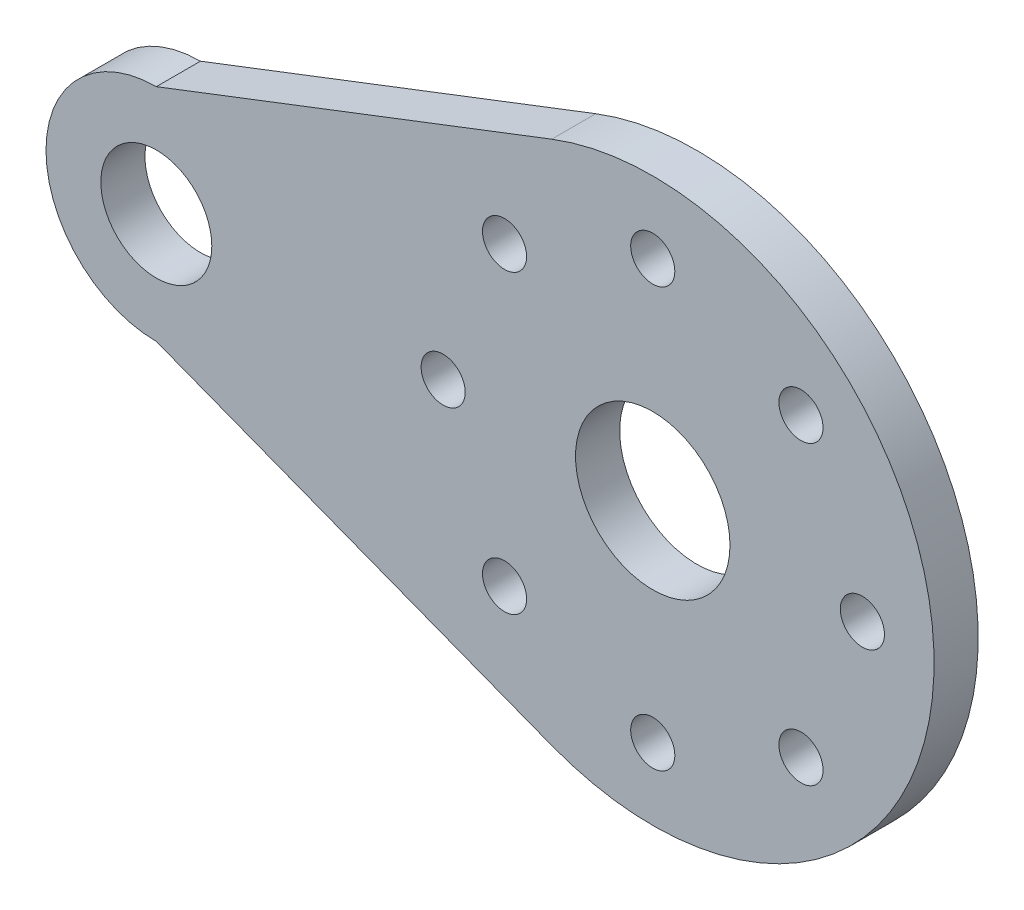
ISO-10303-21;
HEADER;
FILE_DESCRIPTION(('STEP AP214'),'2;1');
FILE_NAME('part.step','',(''),(''),'','','');
FILE_SCHEMA(('AUTOMOTIVE_DESIGN { 1 0 10303 214 1 1 1 1 }'));
ENDSEC;
DATA;
#1=APPLICATION_CONTEXT('core data for automotive mechanical design processes');
#2=APPLICATION_PROTOCOL_DEFINITION('international standard','automotive_design',2000,#1);
#3=PRODUCT_CONTEXT('',#1,'mechanical');
#4=PRODUCT('Part','Part','',(#3));
#5=PRODUCT_RELATED_PRODUCT_CATEGORY('part','',(#4));
#6=PRODUCT_DEFINITION_FORMATION('','',#4);
#7=PRODUCT_DEFINITION_CONTEXT('part definition',#1,'design');
#8=PRODUCT_DEFINITION('design','',#6,#7);
#9=PRODUCT_DEFINITION_SHAPE('','',#8);
#10=(LENGTH_UNIT() NAMED_UNIT(*) SI_UNIT(.MILLI.,.METRE.));
#11=(NAMED_UNIT(*) PLANE_ANGLE_UNIT() SI_UNIT($,.RADIAN.));
#12=(NAMED_UNIT(*) SI_UNIT($,.STERADIAN.) SOLID_ANGLE_UNIT());
#13=UNCERTAINTY_MEASURE_WITH_UNIT(LENGTH_MEASURE(1.E-05),#10,'distance_accuracy_value','');
#14=(GEOMETRIC_REPRESENTATION_CONTEXT(3) GLOBAL_UNCERTAINTY_ASSIGNED_CONTEXT((#13)) GLOBAL_UNIT_ASSIGNED_CONTEXT((#10,
#11,#12)) REPRESENTATION_CONTEXT('',''));
#15=CARTESIAN_POINT('',(0.,0.,0.));
#16=DIRECTION('',(0.,0.,1.));
#17=DIRECTION('',(1.,0.,0.));
#18=AXIS2_PLACEMENT_3D('',#15,#16,#17);
#19=CARTESIAN_POINT('',(95.4647726056997,-16.6382713176005,4.));
#20=DIRECTION('',(0.,0.,-1.));
#21=DIRECTION('',(-1.,0.,0.));
#22=AXIS2_PLACEMENT_3D('',#19,#20,#21);
#23=PLANE('',#22);
#24=CARTESIAN_POINT('',(95.4647726056997,-16.6382713176005,4.));
#25=DIRECTION('',(0.,0.,1.));
#26=DIRECTION('',(-1.,0.,0.));
#27=AXIS2_PLACEMENT_3D('',#24,#25,#26);
#28=CIRCLE('',#27,9.99999999999999);
#29=CARTESIAN_POINT('',(95.4647726056997,-6.63827131760054,4.));
#30=VERTEX_POINT('',#29);
#31=CARTESIAN_POINT('',(95.4647726056997,-26.6382713176005,4.));
#32=VERTEX_POINT('',#31);
#33=EDGE_CURVE('E88',#30,#32,#28,.T.);
#34=ORIENTED_EDGE('',*,*,#33,.T.);
#35=DIRECTION('',(0.9332288586066,-0.359282475865194,0.));
#36=VECTOR('',#35,1.);
#37=CARTESIAN_POINT('',(95.4647726056997,-26.6382713176005,4.));
#38=LINE('',#37,#36);
#39=CARTESIAN_POINT('',(131.303069471137,-40.4356072120686,4.));
#40=VERTEX_POINT('',#39);
#41=EDGE_CURVE('E83',#32,#40,#38,.T.);
#42=ORIENTED_EDGE('',*,*,#41,.T.);
#43=CARTESIAN_POINT('',(140.4647726057,-16.6382713176005,4.));
#44=DIRECTION('',(0.,0.,1.));
#45=DIRECTION('',(-1.,0.,0.));
#46=AXIS2_PLACEMENT_3D('',#43,#44,#45);
#47=CIRCLE('',#46,25.4999999999998);
#48=CARTESIAN_POINT('',(131.303069471137,7.15906457686749,4.));
#49=VERTEX_POINT('',#48);
#50=EDGE_CURVE('E86',#40,#49,#47,.T.);
#51=ORIENTED_EDGE('',*,*,#50,.T.);
#52=DIRECTION('',(-0.933228858606599,-0.359282475865194,0.));
#53=VECTOR('',#52,1.);
#54=CARTESIAN_POINT('',(95.4647726056997,-6.63827131760054,4.));
#55=LINE('',#54,#53);
#56=EDGE_CURVE('E53',#49,#30,#55,.T.);
#57=ORIENTED_EDGE('',*,*,#56,.T.);
#58=EDGE_LOOP('',(#34,#42,#51,#57));
#59=FACE_BOUND('',#58,.T.);
#60=CARTESIAN_POINT('',(140.4647726057,-35.6382713175993,4.));
#61=DIRECTION('',(0.,0.,1.));
#62=DIRECTION('',(1.,0.,0.));
#63=AXIS2_PLACEMENT_3D('',#60,#61,#62);
#64=CIRCLE('',#63,1.99999999999848);
#65=CARTESIAN_POINT('',(142.464772605698,-35.6382713175993,4.));
#66=VERTEX_POINT('',#65);
#67=EDGE_CURVE('E103',#66,#66,#64,.T.);
#68=ORIENTED_EDGE('',*,*,#67,.F.);
#69=EDGE_LOOP('',(#68));
#70=FACE_BOUND('',#69,.T.);
#71=CARTESIAN_POINT('',(140.4647726057,-16.6382713176005,4.));
#72=DIRECTION('',(0.,0.,1.));
#73=DIRECTION('',(1.,0.,0.));
#74=AXIS2_PLACEMENT_3D('',#71,#72,#73);
#75=CIRCLE('',#74,6.99999999999878);
#76=CARTESIAN_POINT('',(147.464772605698,-16.6382713176005,4.));
#77=VERTEX_POINT('',#76);
#78=EDGE_CURVE('E118',#77,#77,#75,.T.);
#79=ORIENTED_EDGE('',*,*,#78,.F.);
#80=EDGE_LOOP('',(#79));
#81=FACE_BOUND('',#80,.T.);
#82=CARTESIAN_POINT('',(127.029743763154,-30.0733001601467,4.));
#83=DIRECTION('',(0.,0.,1.));
#84=DIRECTION('',(1.,0.,0.));
#85=AXIS2_PLACEMENT_3D('',#82,#83,#84);
#86=CIRCLE('',#85,1.99999999999913);
#87=CARTESIAN_POINT('',(129.029743763153,-30.0733001601467,4.));
#88=VERTEX_POINT('',#87);
#89=EDGE_CURVE('E124',#88,#88,#86,.T.);
#90=ORIENTED_EDGE('',*,*,#89,.F.);
#91=EDGE_LOOP('',(#90));
#92=FACE_BOUND('',#91,.T.);
#93=CARTESIAN_POINT('',(121.464772605697,-16.6382713176019,4.));
#94=DIRECTION('',(0.,0.,1.));
#95=DIRECTION('',(1.,0.,0.));
#96=AXIS2_PLACEMENT_3D('',#93,#94,#95);
#97=CIRCLE('',#96,1.99999999999909);
#98=CARTESIAN_POINT('',(123.464772605696,-16.6382713176019,4.));
#99=VERTEX_POINT('',#98);
#100=EDGE_CURVE('E130',#99,#99,#97,.T.);
#101=ORIENTED_EDGE('',*,*,#100,.F.);
#102=EDGE_LOOP('',(#101));
#103=FACE_BOUND('',#102,.T.);
#104=CARTESIAN_POINT('',(127.029743763152,-3.20324247505635,4.));
#105=DIRECTION('',(0.,0.,1.));
#106=DIRECTION('',(1.,0.,0.));
#107=AXIS2_PLACEMENT_3D('',#104,#105,#106);
#108=CIRCLE('',#107,1.99999999999905);
#109=CARTESIAN_POINT('',(129.029743763151,-3.20324247505635,4.));
#110=VERTEX_POINT('',#109);
#111=EDGE_CURVE('E136',#110,#110,#108,.T.);
#112=ORIENTED_EDGE('',*,*,#111,.F.);
#113=EDGE_LOOP('',(#112));
#114=FACE_BOUND('',#113,.T.);
#115=CARTESIAN_POINT('',(95.4647726056997,-16.6382713176005,4.));
#116=DIRECTION('',(0.,0.,1.));
#117=DIRECTION('',(1.,0.,0.));
#118=AXIS2_PLACEMENT_3D('',#115,#116,#117);
#119=CIRCLE('',#118,5.03000000000001);
#120=CARTESIAN_POINT('',(100.4947726057,-16.6382713176005,4.));
#121=VERTEX_POINT('',#120);
#122=EDGE_CURVE('E142',#121,#121,#119,.T.);
#123=ORIENTED_EDGE('',*,*,#122,.F.);
#124=EDGE_LOOP('',(#123));
#125=FACE_BOUND('',#124,.T.);
#126=CARTESIAN_POINT('',(140.464772605697,2.36172868240044,4.));
#127=DIRECTION('',(0.,0.,1.));
#128=DIRECTION('',(1.,0.,0.));
#129=AXIS2_PLACEMENT_3D('',#126,#127,#128);
#130=CIRCLE('',#129,1.99999999999901);
#131=CARTESIAN_POINT('',(142.464772605696,2.36172868240044,4.));
#132=VERTEX_POINT('',#131);
#133=EDGE_CURVE('E148',#132,#132,#130,.T.);
#134=ORIENTED_EDGE('',*,*,#133,.F.);
#135=EDGE_LOOP('',(#134));
#136=FACE_BOUND('',#135,.T.);
#137=CARTESIAN_POINT('',(153.899801448243,-3.20324247505459,4.));
#138=DIRECTION('',(0.,0.,1.));
#139=DIRECTION('',(1.,0.,0.));
#140=AXIS2_PLACEMENT_3D('',#137,#138,#139);
#141=CIRCLE('',#140,1.99999999999897);
#142=CARTESIAN_POINT('',(155.899801448242,-3.20324247505459,4.));
#143=VERTEX_POINT('',#142);
#144=EDGE_CURVE('E154',#143,#143,#141,.T.);
#145=ORIENTED_EDGE('',*,*,#144,.F.);
#146=EDGE_LOOP('',(#145));
#147=FACE_BOUND('',#146,.T.);
#148=CARTESIAN_POINT('',(159.464772605699,-16.6382713175994,4.));
#149=DIRECTION('',(0.,0.,1.));
#150=DIRECTION('',(1.,0.,0.));
#151=AXIS2_PLACEMENT_3D('',#148,#149,#150);
#152=CIRCLE('',#151,1.99999999999895);
#153=CARTESIAN_POINT('',(161.464772605698,-16.6382713175994,4.));
#154=VERTEX_POINT('',#153);
#155=EDGE_CURVE('E160',#154,#154,#152,.T.);
#156=ORIENTED_EDGE('',*,*,#155,.F.);
#157=EDGE_LOOP('',(#156));
#158=FACE_BOUND('',#157,.T.);
#159=CARTESIAN_POINT('',(153.899801448244,-30.0733001601449,4.));
#160=DIRECTION('',(0.,0.,1.));
#161=DIRECTION('',(1.,0.,0.));
#162=AXIS2_PLACEMENT_3D('',#159,#160,#161);
#163=CIRCLE('',#162,1.99999999999894);
#164=CARTESIAN_POINT('',(155.899801448243,-30.0733001601449,4.));
#165=VERTEX_POINT('',#164);
#166=EDGE_CURVE('E166',#165,#165,#163,.T.);
#167=ORIENTED_EDGE('',*,*,#166,.F.);
#168=EDGE_LOOP('',(#167));
#169=FACE_BOUND('',#168,.T.);
#170=ADVANCED_FACE('F36',(#59,#70,#81,#92,#103,#114,#125,#136,#147,#158,#169),#23,.F.);
#171=CARTESIAN_POINT('',(95.4647726056997,-16.6382713176005,0.));
#172=DIRECTION('',(0.,0.,-1.));
#173=DIRECTION('',(-1.,0.,0.));
#174=AXIS2_PLACEMENT_3D('',#171,#172,#173);
#175=PLANE('',#174);
#176=CARTESIAN_POINT('',(159.464772605699,-16.6382713175994,0.));
#177=DIRECTION('',(0.,0.,1.));
#178=DIRECTION('',(1.,0.,0.));
#179=AXIS2_PLACEMENT_3D('',#176,#177,#178);
#180=CIRCLE('',#179,1.99999999999895);
#181=CARTESIAN_POINT('',(161.464772605698,-16.6382713175994,0.));
#182=VERTEX_POINT('',#181);
#183=EDGE_CURVE('E163',#182,#182,#180,.T.);
#184=ORIENTED_EDGE('',*,*,#183,.T.);
#185=EDGE_LOOP('',(#184));
#186=FACE_BOUND('',#185,.T.);
#187=CARTESIAN_POINT('',(140.464772605697,2.36172868240044,0.));
#188=DIRECTION('',(0.,0.,1.));
#189=DIRECTION('',(1.,0.,0.));
#190=AXIS2_PLACEMENT_3D('',#187,#188,#189);
#191=CIRCLE('',#190,1.99999999999901);
#192=CARTESIAN_POINT('',(142.464772605696,2.36172868240044,0.));
#193=VERTEX_POINT('',#192);
#194=EDGE_CURVE('E151',#193,#193,#191,.T.);
#195=ORIENTED_EDGE('',*,*,#194,.T.);
#196=EDGE_LOOP('',(#195));
#197=FACE_BOUND('',#196,.T.);
#198=CARTESIAN_POINT('',(127.029743763152,-3.20324247505635,0.));
#199=DIRECTION('',(0.,0.,1.));
#200=DIRECTION('',(1.,0.,0.));
#201=AXIS2_PLACEMENT_3D('',#198,#199,#200);
#202=CIRCLE('',#201,1.99999999999905);
#203=CARTESIAN_POINT('',(129.029743763151,-3.20324247505635,0.));
#204=VERTEX_POINT('',#203);
#205=EDGE_CURVE('E139',#204,#204,#202,.T.);
#206=ORIENTED_EDGE('',*,*,#205,.T.);
#207=EDGE_LOOP('',(#206));
#208=FACE_BOUND('',#207,.T.);
#209=CARTESIAN_POINT('',(127.029743763154,-30.0733001601467,0.));
#210=DIRECTION('',(0.,0.,1.));
#211=DIRECTION('',(1.,0.,0.));
#212=AXIS2_PLACEMENT_3D('',#209,#210,#211);
#213=CIRCLE('',#212,1.99999999999913);
#214=CARTESIAN_POINT('',(129.029743763153,-30.0733001601467,0.));
#215=VERTEX_POINT('',#214);
#216=EDGE_CURVE('E127',#215,#215,#213,.T.);
#217=ORIENTED_EDGE('',*,*,#216,.T.);
#218=EDGE_LOOP('',(#217));
#219=FACE_BOUND('',#218,.T.);
#220=CARTESIAN_POINT('',(140.4647726057,-35.6382713175993,0.));
#221=DIRECTION('',(0.,0.,1.));
#222=DIRECTION('',(1.,0.,0.));
#223=AXIS2_PLACEMENT_3D('',#220,#221,#222);
#224=CIRCLE('',#223,1.99999999999848);
#225=CARTESIAN_POINT('',(142.464772605698,-35.6382713175993,0.));
#226=VERTEX_POINT('',#225);
#227=EDGE_CURVE('E115',#226,#226,#224,.T.);
#228=ORIENTED_EDGE('',*,*,#227,.T.);
#229=EDGE_LOOP('',(#228));
#230=FACE_BOUND('',#229,.T.);
#231=CARTESIAN_POINT('',(95.4647726056997,-16.6382713176005,0.));
#232=DIRECTION('',(0.,0.,1.));
#233=DIRECTION('',(-1.,0.,0.));
#234=AXIS2_PLACEMENT_3D('',#231,#232,#233);
#235=CIRCLE('',#234,9.99999999999999);
#236=CARTESIAN_POINT('',(95.4647726056997,-6.63827131760054,0.));
#237=VERTEX_POINT('',#236);
#238=CARTESIAN_POINT('',(95.4647726056997,-26.6382713176005,0.));
#239=VERTEX_POINT('',#238);
#240=EDGE_CURVE('E100',#237,#239,#235,.T.);
#241=ORIENTED_EDGE('',*,*,#240,.F.);
#242=DIRECTION('',(-0.933228858606599,-0.359282475865194,0.));
#243=VECTOR('',#242,1.);
#244=CARTESIAN_POINT('',(95.4647726056997,-6.63827131760054,0.));
#245=LINE('',#244,#243);
#246=CARTESIAN_POINT('',(131.303069471137,7.15906457686749,0.));
#247=VERTEX_POINT('',#246);
#248=EDGE_CURVE('E76',#247,#237,#245,.T.);
#249=ORIENTED_EDGE('',*,*,#248,.F.);
#250=CARTESIAN_POINT('',(140.4647726057,-16.6382713176005,0.));
#251=DIRECTION('',(0.,0.,1.));
#252=DIRECTION('',(-1.,0.,0.));
#253=AXIS2_PLACEMENT_3D('',#250,#251,#252);
#254=CIRCLE('',#253,25.4999999999998);
#255=CARTESIAN_POINT('',(131.303069471137,-40.4356072120686,0.));
#256=VERTEX_POINT('',#255);
#257=EDGE_CURVE('E70',#256,#247,#254,.T.);
#258=ORIENTED_EDGE('',*,*,#257,.F.);
#259=DIRECTION('',(0.9332288586066,-0.359282475865194,0.));
#260=VECTOR('',#259,1.);
#261=CARTESIAN_POINT('',(95.4647726056997,-26.6382713176005,0.));
#262=LINE('',#261,#260);
#263=EDGE_CURVE('E92',#239,#256,#262,.T.);
#264=ORIENTED_EDGE('',*,*,#263,.F.);
#265=EDGE_LOOP('',(#241,#249,#258,#264));
#266=FACE_BOUND('',#265,.T.);
#267=CARTESIAN_POINT('',(140.4647726057,-16.6382713176005,0.));
#268=DIRECTION('',(0.,0.,1.));
#269=DIRECTION('',(1.,0.,0.));
#270=AXIS2_PLACEMENT_3D('',#267,#268,#269);
#271=CIRCLE('',#270,6.99999999999878);
#272=CARTESIAN_POINT('',(147.464772605698,-16.6382713176005,0.));
#273=VERTEX_POINT('',#272);
#274=EDGE_CURVE('E121',#273,#273,#271,.T.);
#275=ORIENTED_EDGE('',*,*,#274,.T.);
#276=EDGE_LOOP('',(#275));
#277=FACE_BOUND('',#276,.T.);
#278=CARTESIAN_POINT('',(121.464772605697,-16.6382713176019,0.));
#279=DIRECTION('',(0.,0.,1.));
#280=DIRECTION('',(1.,0.,0.));
#281=AXIS2_PLACEMENT_3D('',#278,#279,#280);
#282=CIRCLE('',#281,1.99999999999909);
#283=CARTESIAN_POINT('',(123.464772605696,-16.6382713176019,0.));
#284=VERTEX_POINT('',#283);
#285=EDGE_CURVE('E133',#284,#284,#282,.T.);
#286=ORIENTED_EDGE('',*,*,#285,.T.);
#287=EDGE_LOOP('',(#286));
#288=FACE_BOUND('',#287,.T.);
#289=CARTESIAN_POINT('',(95.4647726056997,-16.6382713176005,0.));
#290=DIRECTION('',(0.,0.,1.));
#291=DIRECTION('',(1.,0.,0.));
#292=AXIS2_PLACEMENT_3D('',#289,#290,#291);
#293=CIRCLE('',#292,5.03000000000001);
#294=CARTESIAN_POINT('',(100.4947726057,-16.6382713176005,0.));
#295=VERTEX_POINT('',#294);
#296=EDGE_CURVE('E145',#295,#295,#293,.T.);
#297=ORIENTED_EDGE('',*,*,#296,.T.);
#298=EDGE_LOOP('',(#297));
#299=FACE_BOUND('',#298,.T.);
#300=CARTESIAN_POINT('',(153.899801448243,-3.20324247505459,0.));
#301=DIRECTION('',(0.,0.,1.));
#302=DIRECTION('',(1.,0.,0.));
#303=AXIS2_PLACEMENT_3D('',#300,#301,#302);
#304=CIRCLE('',#303,1.99999999999897);
#305=CARTESIAN_POINT('',(155.899801448242,-3.20324247505459,0.));
#306=VERTEX_POINT('',#305);
#307=EDGE_CURVE('E157',#306,#306,#304,.T.);
#308=ORIENTED_EDGE('',*,*,#307,.T.);
#309=EDGE_LOOP('',(#308));
#310=FACE_BOUND('',#309,.T.);
#311=CARTESIAN_POINT('',(153.899801448244,-30.0733001601449,0.));
#312=DIRECTION('',(0.,0.,1.));
#313=DIRECTION('',(1.,0.,0.));
#314=AXIS2_PLACEMENT_3D('',#311,#312,#313);
#315=CIRCLE('',#314,1.99999999999894);
#316=CARTESIAN_POINT('',(155.899801448243,-30.0733001601449,0.));
#317=VERTEX_POINT('',#316);
#318=EDGE_CURVE('E169',#317,#317,#315,.T.);
#319=ORIENTED_EDGE('',*,*,#318,.T.);
#320=EDGE_LOOP('',(#319));
#321=FACE_BOUND('',#320,.T.);
#322=ADVANCED_FACE('F111',(#186,#197,#208,#219,#230,#266,#277,#288,#299,#310,#321),#175,.T.);
#323=CARTESIAN_POINT('',(95.4647726056997,-16.6382713176005,4.));
#324=DIRECTION('',(0.,0.,-1.));
#325=DIRECTION('',(-1.,0.,0.));
#326=AXIS2_PLACEMENT_3D('',#323,#324,#325);
#327=CYLINDRICAL_SURFACE('',#326,9.99999999999999);
#328=ORIENTED_EDGE('',*,*,#240,.T.);
#329=DIRECTION('',(0.,0.,-1.));
#330=VECTOR('',#329,1.);
#331=CARTESIAN_POINT('',(95.4647726056997,-26.6382713176005,4.));
#332=LINE('',#331,#330);
#333=EDGE_CURVE('E11',#32,#239,#332,.T.);
#334=ORIENTED_EDGE('',*,*,#333,.F.);
#335=ORIENTED_EDGE('',*,*,#33,.F.);
#336=DIRECTION('',(0.,0.,-1.));
#337=VECTOR('',#336,1.);
#338=CARTESIAN_POINT('',(95.4647726056997,-6.63827131760054,4.));
#339=LINE('',#338,#337);
#340=EDGE_CURVE('E96',#30,#237,#339,.T.);
#341=ORIENTED_EDGE('',*,*,#340,.T.);
#342=EDGE_LOOP('',(#328,#334,#335,#341));
#343=FACE_BOUND('',#342,.T.);
#344=ADVANCED_FACE('F38',(#343),#327,.T.);
#345=CARTESIAN_POINT('',(95.4647726056997,-26.6382713176005,4.));
#346=DIRECTION('',(0.359282475865194,0.933228858606599,0.));
#347=DIRECTION('',(-0.9332288586066,0.359282475865194,0.));
#348=AXIS2_PLACEMENT_3D('',#345,#346,#347);
#349=PLANE('',#348);
#350=ORIENTED_EDGE('',*,*,#263,.T.);
#351=DIRECTION('',(0.,0.,-1.));
#352=VECTOR('',#351,1.);
#353=CARTESIAN_POINT('',(131.303069471137,-40.4356072120686,4.));
#354=LINE('',#353,#352);
#355=EDGE_CURVE('E45',#40,#256,#354,.T.);
#356=ORIENTED_EDGE('',*,*,#355,.F.);
#357=ORIENTED_EDGE('',*,*,#41,.F.);
#358=ORIENTED_EDGE('',*,*,#333,.T.);
#359=EDGE_LOOP('',(#350,#356,#357,#358));
#360=FACE_BOUND('',#359,.T.);
#361=ADVANCED_FACE('F91',(#360),#349,.F.);
#362=CARTESIAN_POINT('',(140.4647726057,-16.6382713176005,4.));
#363=DIRECTION('',(0.,0.,-1.));
#364=DIRECTION('',(-1.,0.,0.));
#365=AXIS2_PLACEMENT_3D('',#362,#363,#364);
#366=CYLINDRICAL_SURFACE('',#365,25.4999999999998);
#367=ORIENTED_EDGE('',*,*,#257,.T.);
#368=DIRECTION('',(0.,0.,-1.));
#369=VECTOR('',#368,1.);
#370=CARTESIAN_POINT('',(131.303069471137,7.15906457686749,4.));
#371=LINE('',#370,#369);
#372=EDGE_CURVE('E93',#49,#247,#371,.T.);
#373=ORIENTED_EDGE('',*,*,#372,.F.);
#374=ORIENTED_EDGE('',*,*,#50,.F.);
#375=ORIENTED_EDGE('',*,*,#355,.T.);
#376=EDGE_LOOP('',(#367,#373,#374,#375));
#377=FACE_BOUND('',#376,.T.);
#378=ADVANCED_FACE('F94',(#377),#366,.T.);
#379=CARTESIAN_POINT('',(95.4647726056997,-6.63827131760054,4.));
#380=DIRECTION('',(0.359282475865194,-0.933228858606599,0.));
#381=DIRECTION('',(0.9332288586066,0.359282475865194,0.));
#382=AXIS2_PLACEMENT_3D('',#379,#380,#381);
#383=PLANE('',#382);
#384=ORIENTED_EDGE('',*,*,#248,.T.);
#385=ORIENTED_EDGE('',*,*,#340,.F.);
#386=ORIENTED_EDGE('',*,*,#56,.F.);
#387=ORIENTED_EDGE('',*,*,#372,.T.);
#388=EDGE_LOOP('',(#384,#385,#386,#387));
#389=FACE_BOUND('',#388,.T.);
#390=ADVANCED_FACE('F108',(#389),#383,.F.);
#391=CARTESIAN_POINT('',(140.4647726057,-35.6382713175993,4.));
#392=DIRECTION('',(0.,0.,-1.));
#393=DIRECTION('',(-1.,0.,0.));
#394=AXIS2_PLACEMENT_3D('',#391,#392,#393);
#395=CYLINDRICAL_SURFACE('',#394,1.99999999999848);
#396=ORIENTED_EDGE('',*,*,#67,.T.);
#397=EDGE_LOOP('',(#396));
#398=FACE_BOUND('',#397,.T.);
#399=ORIENTED_EDGE('',*,*,#227,.F.);
#400=EDGE_LOOP('',(#399));
#401=FACE_BOUND('',#400,.T.);
#402=ADVANCED_FACE('F186',(#398,#401),#395,.F.);
#403=CARTESIAN_POINT('',(140.4647726057,-16.6382713176005,4.));
#404=DIRECTION('',(0.,0.,-1.));
#405=DIRECTION('',(-1.,0.,0.));
#406=AXIS2_PLACEMENT_3D('',#403,#404,#405);
#407=CYLINDRICAL_SURFACE('',#406,6.99999999999878);
#408=ORIENTED_EDGE('',*,*,#78,.T.);
#409=EDGE_LOOP('',(#408));
#410=FACE_BOUND('',#409,.T.);
#411=ORIENTED_EDGE('',*,*,#274,.F.);
#412=EDGE_LOOP('',(#411));
#413=FACE_BOUND('',#412,.T.);
#414=ADVANCED_FACE('F232',(#410,#413),#407,.F.);
#415=CARTESIAN_POINT('',(127.029743763154,-30.0733001601467,4.));
#416=DIRECTION('',(0.,0.,-1.));
#417=DIRECTION('',(-1.,0.,0.));
#418=AXIS2_PLACEMENT_3D('',#415,#416,#417);
#419=CYLINDRICAL_SURFACE('',#418,1.99999999999913);
#420=ORIENTED_EDGE('',*,*,#89,.T.);
#421=EDGE_LOOP('',(#420));
#422=FACE_BOUND('',#421,.T.);
#423=ORIENTED_EDGE('',*,*,#216,.F.);
#424=EDGE_LOOP('',(#423));
#425=FACE_BOUND('',#424,.T.);
#426=ADVANCED_FACE('F240',(#422,#425),#419,.F.);
#427=CARTESIAN_POINT('',(121.464772605697,-16.6382713176019,4.));
#428=DIRECTION('',(0.,0.,-1.));
#429=DIRECTION('',(-1.,0.,0.));
#430=AXIS2_PLACEMENT_3D('',#427,#428,#429);
#431=CYLINDRICAL_SURFACE('',#430,1.99999999999909);
#432=ORIENTED_EDGE('',*,*,#100,.T.);
#433=EDGE_LOOP('',(#432));
#434=FACE_BOUND('',#433,.T.);
#435=ORIENTED_EDGE('',*,*,#285,.F.);
#436=EDGE_LOOP('',(#435));
#437=FACE_BOUND('',#436,.T.);
#438=ADVANCED_FACE('F248',(#434,#437),#431,.F.);
#439=CARTESIAN_POINT('',(127.029743763152,-3.20324247505635,4.));
#440=DIRECTION('',(0.,0.,-1.));
#441=DIRECTION('',(-1.,0.,0.));
#442=AXIS2_PLACEMENT_3D('',#439,#440,#441);
#443=CYLINDRICAL_SURFACE('',#442,1.99999999999905);
#444=ORIENTED_EDGE('',*,*,#111,.T.);
#445=EDGE_LOOP('',(#444));
#446=FACE_BOUND('',#445,.T.);
#447=ORIENTED_EDGE('',*,*,#205,.F.);
#448=EDGE_LOOP('',(#447));
#449=FACE_BOUND('',#448,.T.);
#450=ADVANCED_FACE('F257',(#446,#449),#443,.F.);
#451=CARTESIAN_POINT('',(95.4647726056997,-16.6382713176005,4.));
#452=DIRECTION('',(0.,0.,-1.));
#453=DIRECTION('',(-1.,0.,0.));
#454=AXIS2_PLACEMENT_3D('',#451,#452,#453);
#455=CYLINDRICAL_SURFACE('',#454,5.03000000000001);
#456=ORIENTED_EDGE('',*,*,#122,.T.);
#457=EDGE_LOOP('',(#456));
#458=FACE_BOUND('',#457,.T.);
#459=ORIENTED_EDGE('',*,*,#296,.F.);
#460=EDGE_LOOP('',(#459));
#461=FACE_BOUND('',#460,.T.);
#462=ADVANCED_FACE('F266',(#458,#461),#455,.F.);
#463=CARTESIAN_POINT('',(140.464772605697,2.36172868240044,4.));
#464=DIRECTION('',(0.,0.,-1.));
#465=DIRECTION('',(-1.,0.,0.));
#466=AXIS2_PLACEMENT_3D('',#463,#464,#465);
#467=CYLINDRICAL_SURFACE('',#466,1.99999999999901);
#468=ORIENTED_EDGE('',*,*,#133,.T.);
#469=EDGE_LOOP('',(#468));
#470=FACE_BOUND('',#469,.T.);
#471=ORIENTED_EDGE('',*,*,#194,.F.);
#472=EDGE_LOOP('',(#471));
#473=FACE_BOUND('',#472,.T.);
#474=ADVANCED_FACE('F275',(#470,#473),#467,.F.);
#475=CARTESIAN_POINT('',(153.899801448243,-3.20324247505459,4.));
#476=DIRECTION('',(0.,0.,-1.));
#477=DIRECTION('',(-1.,0.,0.));
#478=AXIS2_PLACEMENT_3D('',#475,#476,#477);
#479=CYLINDRICAL_SURFACE('',#478,1.99999999999897);
#480=ORIENTED_EDGE('',*,*,#144,.T.);
#481=EDGE_LOOP('',(#480));
#482=FACE_BOUND('',#481,.T.);
#483=ORIENTED_EDGE('',*,*,#307,.F.);
#484=EDGE_LOOP('',(#483));
#485=FACE_BOUND('',#484,.T.);
#486=ADVANCED_FACE('F284',(#482,#485),#479,.F.);
#487=CARTESIAN_POINT('',(159.464772605699,-16.6382713175994,4.));
#488=DIRECTION('',(0.,0.,-1.));
#489=DIRECTION('',(-1.,0.,0.));
#490=AXIS2_PLACEMENT_3D('',#487,#488,#489);
#491=CYLINDRICAL_SURFACE('',#490,1.99999999999895);
#492=ORIENTED_EDGE('',*,*,#155,.T.);
#493=EDGE_LOOP('',(#492));
#494=FACE_BOUND('',#493,.T.);
#495=ORIENTED_EDGE('',*,*,#183,.F.);
#496=EDGE_LOOP('',(#495));
#497=FACE_BOUND('',#496,.T.);
#498=ADVANCED_FACE('F293',(#494,#497),#491,.F.);
#499=CARTESIAN_POINT('',(153.899801448244,-30.0733001601449,4.));
#500=DIRECTION('',(0.,0.,-1.));
#501=DIRECTION('',(-1.,0.,0.));
#502=AXIS2_PLACEMENT_3D('',#499,#500,#501);
#503=CYLINDRICAL_SURFACE('',#502,1.99999999999894);
#504=ORIENTED_EDGE('',*,*,#166,.T.);
#505=EDGE_LOOP('',(#504));
#506=FACE_BOUND('',#505,.T.);
#507=ORIENTED_EDGE('',*,*,#318,.F.);
#508=EDGE_LOOP('',(#507));
#509=FACE_BOUND('',#508,.T.);
#510=ADVANCED_FACE('F175',(#506,#509),#503,.F.);
#511=CLOSED_SHELL('',(#170,#322,#344,#361,#378,#390,#402,#414,#426,#438,#450,#462,#474,#486,
#498,#510));
#512=MANIFOLD_SOLID_BREP('B2',#511);
#513=ADVANCED_BREP_SHAPE_REPRESENTATION('',(#18,#512),#14);
#514=SHAPE_DEFINITION_REPRESENTATION(#9,#513);
ENDSEC;
END-ISO-10303-21;
